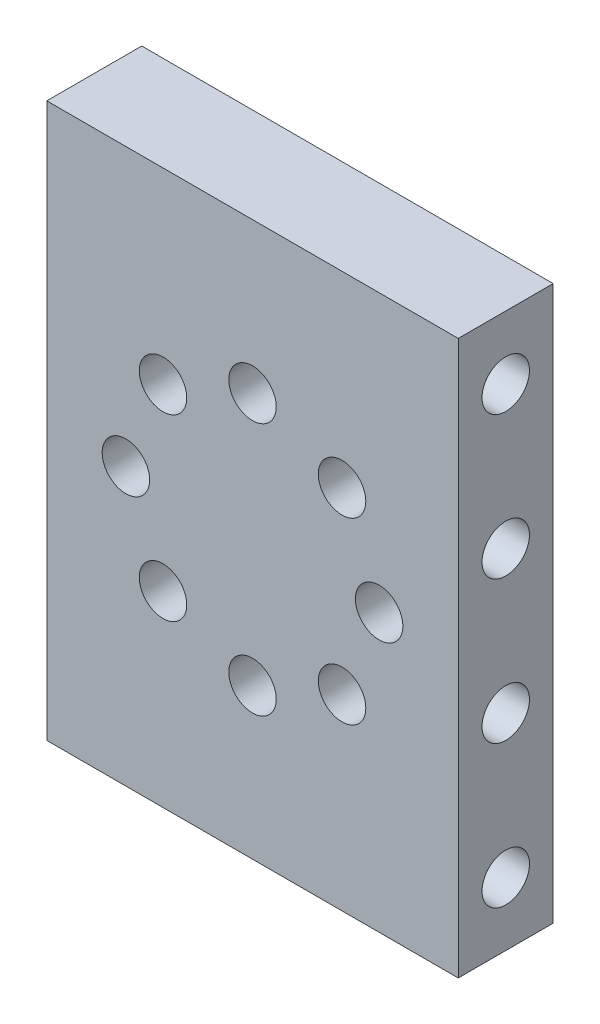
ISO-10303-21;
HEADER;
FILE_DESCRIPTION(('STEP AP214'),'2;1');
FILE_NAME('part.step','',(''),(''),'','','');
FILE_SCHEMA(('AUTOMOTIVE_DESIGN { 1 0 10303 214 1 1 1 1 }'));
ENDSEC;
DATA;
#1=APPLICATION_CONTEXT('core data for automotive mechanical design processes');
#2=APPLICATION_PROTOCOL_DEFINITION('international standard','automotive_design',2000,#1);
#3=PRODUCT_CONTEXT('',#1,'mechanical');
#4=PRODUCT('Part','Part','',(#3));
#5=PRODUCT_RELATED_PRODUCT_CATEGORY('part','',(#4));
#6=PRODUCT_DEFINITION_FORMATION('','',#4);
#7=PRODUCT_DEFINITION_CONTEXT('part definition',#1,'design');
#8=PRODUCT_DEFINITION('design','',#6,#7);
#9=PRODUCT_DEFINITION_SHAPE('','',#8);
#10=(LENGTH_UNIT() NAMED_UNIT(*) SI_UNIT(.MILLI.,.METRE.));
#11=(NAMED_UNIT(*) PLANE_ANGLE_UNIT() SI_UNIT($,.RADIAN.));
#12=(NAMED_UNIT(*) SI_UNIT($,.STERADIAN.) SOLID_ANGLE_UNIT());
#13=UNCERTAINTY_MEASURE_WITH_UNIT(LENGTH_MEASURE(1.E-05),#10,'distance_accuracy_value','');
#14=(GEOMETRIC_REPRESENTATION_CONTEXT(3) GLOBAL_UNCERTAINTY_ASSIGNED_CONTEXT((#13)) GLOBAL_UNIT_ASSIGNED_CONTEXT((#10,
#11,#12)) REPRESENTATION_CONTEXT('',''));
#15=CARTESIAN_POINT('',(0.,0.,0.));
#16=DIRECTION('',(0.,0.,1.));
#17=DIRECTION('',(1.,0.,0.));
#18=AXIS2_PLACEMENT_3D('',#15,#16,#17);
#19=CARTESIAN_POINT('',(-26.,-35.,12.));
#20=DIRECTION('',(1.,0.,0.));
#21=DIRECTION('',(0.,0.,-1.));
#22=AXIS2_PLACEMENT_3D('',#19,#20,#21);
#23=PLANE('',#22);
#24=CARTESIAN_POINT('',(-26.,27.,6.));
#25=DIRECTION('',(-1.,0.,0.));
#26=DIRECTION('',(0.,0.,1.));
#27=AXIS2_PLACEMENT_3D('',#24,#25,#26);
#28=CIRCLE('',#27,3.);
#29=CARTESIAN_POINT('',(-26.,27.,9.));
#30=VERTEX_POINT('',#29);
#31=EDGE_CURVE('E129',#30,#30,#28,.T.);
#32=ORIENTED_EDGE('',*,*,#31,.F.);
#33=EDGE_LOOP('',(#32));
#34=FACE_BOUND('',#33,.T.);
#35=CARTESIAN_POINT('',(-26.,9.00000000000001,6.00000000000019));
#36=DIRECTION('',(-1.,0.,0.));
#37=DIRECTION('',(0.,0.,1.));
#38=AXIS2_PLACEMENT_3D('',#35,#36,#37);
#39=CIRCLE('',#38,3.);
#40=CARTESIAN_POINT('',(-26.,9.00000000000001,9.00000000000019));
#41=VERTEX_POINT('',#40);
#42=EDGE_CURVE('E123',#41,#41,#39,.T.);
#43=ORIENTED_EDGE('',*,*,#42,.F.);
#44=EDGE_LOOP('',(#43));
#45=FACE_BOUND('',#44,.T.);
#46=CARTESIAN_POINT('',(-26.,-8.99999999999999,6.00000000000037));
#47=DIRECTION('',(-1.,0.,0.));
#48=DIRECTION('',(0.,0.,1.));
#49=AXIS2_PLACEMENT_3D('',#46,#47,#48);
#50=CIRCLE('',#49,3.);
#51=CARTESIAN_POINT('',(-26.,-8.99999999999999,9.00000000000038));
#52=VERTEX_POINT('',#51);
#53=EDGE_CURVE('E117',#52,#52,#50,.T.);
#54=ORIENTED_EDGE('',*,*,#53,.F.);
#55=EDGE_LOOP('',(#54));
#56=FACE_BOUND('',#55,.T.);
#57=CARTESIAN_POINT('',(-26.,-27.,6.00000000000056));
#58=DIRECTION('',(-1.,0.,0.));
#59=DIRECTION('',(0.,0.,1.));
#60=AXIS2_PLACEMENT_3D('',#57,#58,#59);
#61=CIRCLE('',#60,3.);
#62=CARTESIAN_POINT('',(-26.,-27.,9.00000000000056));
#63=VERTEX_POINT('',#62);
#64=EDGE_CURVE('E110',#63,#63,#61,.T.);
#65=ORIENTED_EDGE('',*,*,#64,.F.);
#66=EDGE_LOOP('',(#65));
#67=FACE_BOUND('',#66,.T.);
#68=DIRECTION('',(0.,-1.,0.));
#69=VECTOR('',#68,1.);
#70=CARTESIAN_POINT('',(-26.,-35.,0.));
#71=LINE('',#70,#69);
#72=CARTESIAN_POINT('',(-26.,35.,0.));
#73=VERTEX_POINT('',#72);
#74=CARTESIAN_POINT('',(-26.,-35.,0.));
#75=VERTEX_POINT('',#74);
#76=EDGE_CURVE('E96',#73,#75,#71,.T.);
#77=ORIENTED_EDGE('',*,*,#76,.T.);
#78=DIRECTION('',(0.,0.,-1.));
#79=VECTOR('',#78,1.);
#80=CARTESIAN_POINT('',(-26.,-35.,12.));
#81=LINE('',#80,#79);
#82=CARTESIAN_POINT('',(-26.,-35.,12.));
#83=VERTEX_POINT('',#82);
#84=EDGE_CURVE('E11',#83,#75,#81,.T.);
#85=ORIENTED_EDGE('',*,*,#84,.F.);
#86=DIRECTION('',(0.,-1.,0.));
#87=VECTOR('',#86,1.);
#88=CARTESIAN_POINT('',(-26.,-35.,12.));
#89=LINE('',#88,#87);
#90=CARTESIAN_POINT('',(-26.,35.,12.));
#91=VERTEX_POINT('',#90);
#92=EDGE_CURVE('E84',#91,#83,#89,.T.);
#93=ORIENTED_EDGE('',*,*,#92,.F.);
#94=DIRECTION('',(0.,0.,-1.));
#95=VECTOR('',#94,1.);
#96=CARTESIAN_POINT('',(-26.,35.,12.));
#97=LINE('',#96,#95);
#98=EDGE_CURVE('E92',#91,#73,#97,.T.);
#99=ORIENTED_EDGE('',*,*,#98,.T.);
#100=EDGE_LOOP('',(#77,#85,#93,#99));
#101=FACE_BOUND('',#100,.T.);
#102=ADVANCED_FACE('F33',(#34,#45,#56,#67,#101),#23,.F.);
#103=CARTESIAN_POINT('',(26.,-35.,12.));
#104=DIRECTION('',(0.,1.,0.));
#105=DIRECTION('',(-1.,0.,0.));
#106=AXIS2_PLACEMENT_3D('',#103,#104,#105);
#107=PLANE('',#106);
#108=DIRECTION('',(1.,0.,0.));
#109=VECTOR('',#108,1.);
#110=CARTESIAN_POINT('',(26.,-35.,0.));
#111=LINE('',#110,#109);
#112=CARTESIAN_POINT('',(26.,-35.,0.));
#113=VERTEX_POINT('',#112);
#114=EDGE_CURVE('E88',#75,#113,#111,.T.);
#115=ORIENTED_EDGE('',*,*,#114,.T.);
#116=DIRECTION('',(0.,0.,-1.));
#117=VECTOR('',#116,1.);
#118=CARTESIAN_POINT('',(26.,-35.,12.));
#119=LINE('',#118,#117);
#120=CARTESIAN_POINT('',(26.,-35.,12.));
#121=VERTEX_POINT('',#120);
#122=EDGE_CURVE('E41',#121,#113,#119,.T.);
#123=ORIENTED_EDGE('',*,*,#122,.F.);
#124=DIRECTION('',(1.,0.,0.));
#125=VECTOR('',#124,1.);
#126=CARTESIAN_POINT('',(26.,-35.,12.));
#127=LINE('',#126,#125);
#128=EDGE_CURVE('E79',#83,#121,#127,.T.);
#129=ORIENTED_EDGE('',*,*,#128,.F.);
#130=ORIENTED_EDGE('',*,*,#84,.T.);
#131=EDGE_LOOP('',(#115,#123,#129,#130));
#132=FACE_BOUND('',#131,.T.);
#133=ADVANCED_FACE('F87',(#132),#107,.F.);
#134=CARTESIAN_POINT('',(26.,-35.,12.));
#135=DIRECTION('',(-1.,0.,0.));
#136=DIRECTION('',(0.,0.,1.));
#137=AXIS2_PLACEMENT_3D('',#134,#135,#136);
#138=PLANE('',#137);
#139=CARTESIAN_POINT('',(26.,27.,6.));
#140=DIRECTION('',(1.,0.,0.));
#141=DIRECTION('',(0.,0.,-1.));
#142=AXIS2_PLACEMENT_3D('',#139,#140,#141);
#143=CIRCLE('',#142,3.);
#144=CARTESIAN_POINT('',(26.,27.,3.));
#145=VERTEX_POINT('',#144);
#146=EDGE_CURVE('E153',#145,#145,#143,.T.);
#147=ORIENTED_EDGE('',*,*,#146,.F.);
#148=EDGE_LOOP('',(#147));
#149=FACE_BOUND('',#148,.T.);
#150=CARTESIAN_POINT('',(26.,9.00000000000001,5.99999999999981));
#151=DIRECTION('',(1.,0.,0.));
#152=DIRECTION('',(0.,0.,-1.));
#153=AXIS2_PLACEMENT_3D('',#150,#151,#152);
#154=CIRCLE('',#153,3.);
#155=CARTESIAN_POINT('',(26.,9.00000000000001,2.99999999999981));
#156=VERTEX_POINT('',#155);
#157=EDGE_CURVE('E147',#156,#156,#154,.T.);
#158=ORIENTED_EDGE('',*,*,#157,.F.);
#159=EDGE_LOOP('',(#158));
#160=FACE_BOUND('',#159,.T.);
#161=CARTESIAN_POINT('',(26.,-8.99999999999999,5.99999999999963));
#162=DIRECTION('',(1.,0.,0.));
#163=DIRECTION('',(0.,0.,-1.));
#164=AXIS2_PLACEMENT_3D('',#161,#162,#163);
#165=CIRCLE('',#164,3.);
#166=CARTESIAN_POINT('',(26.,-8.99999999999999,2.99999999999963));
#167=VERTEX_POINT('',#166);
#168=EDGE_CURVE('E141',#167,#167,#165,.T.);
#169=ORIENTED_EDGE('',*,*,#168,.F.);
#170=EDGE_LOOP('',(#169));
#171=FACE_BOUND('',#170,.T.);
#172=CARTESIAN_POINT('',(26.,-27.,5.99999999999944));
#173=DIRECTION('',(1.,0.,0.));
#174=DIRECTION('',(0.,0.,-1.));
#175=AXIS2_PLACEMENT_3D('',#172,#173,#174);
#176=CIRCLE('',#175,3.);
#177=CARTESIAN_POINT('',(26.,-27.,2.99999999999944));
#178=VERTEX_POINT('',#177);
#179=EDGE_CURVE('E134',#178,#178,#176,.T.);
#180=ORIENTED_EDGE('',*,*,#179,.F.);
#181=EDGE_LOOP('',(#180));
#182=FACE_BOUND('',#181,.T.);
#183=DIRECTION('',(0.,1.,0.));
#184=VECTOR('',#183,1.);
#185=CARTESIAN_POINT('',(26.,-35.,0.));
#186=LINE('',#185,#184);
#187=CARTESIAN_POINT('',(26.,35.,0.));
#188=VERTEX_POINT('',#187);
#189=EDGE_CURVE('E66',#113,#188,#186,.T.);
#190=ORIENTED_EDGE('',*,*,#189,.T.);
#191=DIRECTION('',(0.,0.,-1.));
#192=VECTOR('',#191,1.);
#193=CARTESIAN_POINT('',(26.,35.,12.));
#194=LINE('',#193,#192);
#195=CARTESIAN_POINT('',(26.,35.,12.));
#196=VERTEX_POINT('',#195);
#197=EDGE_CURVE('E89',#196,#188,#194,.T.);
#198=ORIENTED_EDGE('',*,*,#197,.F.);
#199=DIRECTION('',(0.,1.,0.));
#200=VECTOR('',#199,1.);
#201=CARTESIAN_POINT('',(26.,-35.,12.));
#202=LINE('',#201,#200);
#203=EDGE_CURVE('E82',#121,#196,#202,.T.);
#204=ORIENTED_EDGE('',*,*,#203,.F.);
#205=ORIENTED_EDGE('',*,*,#122,.T.);
#206=EDGE_LOOP('',(#190,#198,#204,#205));
#207=FACE_BOUND('',#206,.T.);
#208=ADVANCED_FACE('F90',(#149,#160,#171,#182,#207),#138,.F.);
#209=CARTESIAN_POINT('',(26.,35.,12.));
#210=DIRECTION('',(0.,-1.,0.));
#211=DIRECTION('',(0.,0.,-1.));
#212=AXIS2_PLACEMENT_3D('',#209,#210,#211);
#213=PLANE('',#212);
#214=DIRECTION('',(-1.,0.,0.));
#215=VECTOR('',#214,1.);
#216=CARTESIAN_POINT('',(26.,35.,0.));
#217=LINE('',#216,#215);
#218=EDGE_CURVE('E72',#188,#73,#217,.T.);
#219=ORIENTED_EDGE('',*,*,#218,.T.);
#220=ORIENTED_EDGE('',*,*,#98,.F.);
#221=DIRECTION('',(-1.,0.,0.));
#222=VECTOR('',#221,1.);
#223=CARTESIAN_POINT('',(26.,35.,12.));
#224=LINE('',#223,#222);
#225=EDGE_CURVE('E49',#196,#91,#224,.T.);
#226=ORIENTED_EDGE('',*,*,#225,.F.);
#227=ORIENTED_EDGE('',*,*,#197,.T.);
#228=EDGE_LOOP('',(#219,#220,#226,#227));
#229=FACE_BOUND('',#228,.T.);
#230=ADVANCED_FACE('F104',(#229),#213,.F.);
#231=CARTESIAN_POINT('',(0.,0.,12.));
#232=DIRECTION('',(0.,0.,1.));
#233=DIRECTION('',(1.,0.,0.));
#234=AXIS2_PLACEMENT_3D('',#231,#232,#233);
#235=PLANE('',#234);
#236=CARTESIAN_POINT('',(11.3137084989849,11.3137084989846,12.));
#237=DIRECTION('',(0.,0.,1.));
#238=DIRECTION('',(1.,0.,0.));
#239=AXIS2_PLACEMENT_3D('',#236,#237,#238);
#240=CIRCLE('',#239,3.);
#241=CARTESIAN_POINT('',(14.3137084989849,11.3137084989846,12.));
#242=VERTEX_POINT('',#241);
#243=EDGE_CURVE('E164',#242,#242,#240,.T.);
#244=ORIENTED_EDGE('',*,*,#243,.F.);
#245=EDGE_LOOP('',(#244));
#246=FACE_BOUND('',#245,.T.);
#247=CARTESIAN_POINT('',(1.6759110426447E-13,16.,12.));
#248=DIRECTION('',(0.,0.,1.));
#249=DIRECTION('',(1.,0.,0.));
#250=AXIS2_PLACEMENT_3D('',#247,#248,#249);
#251=CIRCLE('',#250,3.);
#252=CARTESIAN_POINT('',(3.00000000000017,16.,12.));
#253=VERTEX_POINT('',#252);
#254=EDGE_CURVE('E170',#253,#253,#251,.T.);
#255=ORIENTED_EDGE('',*,*,#254,.F.);
#256=EDGE_LOOP('',(#255));
#257=FACE_BOUND('',#256,.T.);
#258=CARTESIAN_POINT('',(-11.3137084989847,11.3137084989849,12.));
#259=DIRECTION('',(0.,0.,1.));
#260=DIRECTION('',(1.,0.,0.));
#261=AXIS2_PLACEMENT_3D('',#258,#259,#260);
#262=CIRCLE('',#261,3.);
#263=CARTESIAN_POINT('',(-8.31370849898466,11.3137084989849,12.));
#264=VERTEX_POINT('',#263);
#265=EDGE_CURVE('E176',#264,#264,#262,.T.);
#266=ORIENTED_EDGE('',*,*,#265,.F.);
#267=EDGE_LOOP('',(#266));
#268=FACE_BOUND('',#267,.T.);
#269=CARTESIAN_POINT('',(-16.,1.1172740284298E-13,12.));
#270=DIRECTION('',(0.,0.,1.));
#271=DIRECTION('',(1.,0.,0.));
#272=AXIS2_PLACEMENT_3D('',#269,#270,#271);
#273=CIRCLE('',#272,3.);
#274=CARTESIAN_POINT('',(-13.,1.1172740284298E-13,12.));
#275=VERTEX_POINT('',#274);
#276=EDGE_CURVE('E182',#275,#275,#273,.T.);
#277=ORIENTED_EDGE('',*,*,#276,.F.);
#278=EDGE_LOOP('',(#277));
#279=FACE_BOUND('',#278,.T.);
#280=CARTESIAN_POINT('',(-11.3137084989848,-11.3137084989847,12.));
#281=DIRECTION('',(0.,0.,1.));
#282=DIRECTION('',(1.,0.,0.));
#283=AXIS2_PLACEMENT_3D('',#280,#281,#282);
#284=CIRCLE('',#283,3.);
#285=CARTESIAN_POINT('',(-8.31370849898482,-11.3137084989847,12.));
#286=VERTEX_POINT('',#285);
#287=EDGE_CURVE('E188',#286,#286,#284,.T.);
#288=ORIENTED_EDGE('',*,*,#287,.F.);
#289=EDGE_LOOP('',(#288));
#290=FACE_BOUND('',#289,.T.);
#291=CARTESIAN_POINT('',(0.,-16.,12.));
#292=DIRECTION('',(0.,0.,1.));
#293=DIRECTION('',(1.,0.,0.));
#294=AXIS2_PLACEMENT_3D('',#291,#292,#293);
#295=CIRCLE('',#294,3.);
#296=CARTESIAN_POINT('',(2.99999999999995,-16.,12.));
#297=VERTEX_POINT('',#296);
#298=EDGE_CURVE('E194',#297,#297,#295,.T.);
#299=ORIENTED_EDGE('',*,*,#298,.F.);
#300=EDGE_LOOP('',(#299));
#301=FACE_BOUND('',#300,.T.);
#302=CARTESIAN_POINT('',(11.3137084989847,-11.3137084989848,12.));
#303=DIRECTION('',(0.,0.,1.));
#304=DIRECTION('',(1.,0.,0.));
#305=AXIS2_PLACEMENT_3D('',#302,#303,#304);
#306=CIRCLE('',#305,3.);
#307=CARTESIAN_POINT('',(14.3137084989847,-11.3137084989848,12.));
#308=VERTEX_POINT('',#307);
#309=EDGE_CURVE('E200',#308,#308,#306,.T.);
#310=ORIENTED_EDGE('',*,*,#309,.F.);
#311=EDGE_LOOP('',(#310));
#312=FACE_BOUND('',#311,.T.);
#313=CARTESIAN_POINT('',(16.,0.,12.));
#314=DIRECTION('',(0.,0.,1.));
#315=DIRECTION('',(1.,0.,0.));
#316=AXIS2_PLACEMENT_3D('',#313,#314,#315);
#317=CIRCLE('',#316,3.);
#318=CARTESIAN_POINT('',(19.,0.,12.));
#319=VERTEX_POINT('',#318);
#320=EDGE_CURVE('E158',#319,#319,#317,.T.);
#321=ORIENTED_EDGE('',*,*,#320,.F.);
#322=EDGE_LOOP('',(#321));
#323=FACE_BOUND('',#322,.T.);
#324=ORIENTED_EDGE('',*,*,#92,.T.);
#325=ORIENTED_EDGE('',*,*,#128,.T.);
#326=ORIENTED_EDGE('',*,*,#203,.T.);
#327=ORIENTED_EDGE('',*,*,#225,.T.);
#328=EDGE_LOOP('',(#324,#325,#326,#327));
#329=FACE_BOUND('',#328,.T.);
#330=ADVANCED_FACE('F80',(#246,#257,#268,#279,#290,#301,#312,#323,#329),#235,.T.);
#331=CARTESIAN_POINT('',(0.,0.,0.));
#332=DIRECTION('',(0.,0.,1.));
#333=DIRECTION('',(1.,0.,0.));
#334=AXIS2_PLACEMENT_3D('',#331,#332,#333);
#335=PLANE('',#334);
#336=CARTESIAN_POINT('',(11.3137084989849,11.3137084989846,0.));
#337=DIRECTION('',(0.,0.,1.));
#338=DIRECTION('',(1.,0.,0.));
#339=AXIS2_PLACEMENT_3D('',#336,#337,#338);
#340=CIRCLE('',#339,3.);
#341=CARTESIAN_POINT('',(14.3137084989849,11.3137084989846,0.));
#342=VERTEX_POINT('',#341);
#343=EDGE_CURVE('E167',#342,#342,#340,.T.);
#344=ORIENTED_EDGE('',*,*,#343,.T.);
#345=EDGE_LOOP('',(#344));
#346=FACE_BOUND('',#345,.T.);
#347=CARTESIAN_POINT('',(1.6759110426447E-13,16.,0.));
#348=DIRECTION('',(0.,0.,1.));
#349=DIRECTION('',(1.,0.,0.));
#350=AXIS2_PLACEMENT_3D('',#347,#348,#349);
#351=CIRCLE('',#350,3.);
#352=CARTESIAN_POINT('',(3.00000000000017,16.,0.));
#353=VERTEX_POINT('',#352);
#354=EDGE_CURVE('E173',#353,#353,#351,.T.);
#355=ORIENTED_EDGE('',*,*,#354,.T.);
#356=EDGE_LOOP('',(#355));
#357=FACE_BOUND('',#356,.T.);
#358=CARTESIAN_POINT('',(-11.3137084989847,11.3137084989849,0.));
#359=DIRECTION('',(0.,0.,1.));
#360=DIRECTION('',(1.,0.,0.));
#361=AXIS2_PLACEMENT_3D('',#358,#359,#360);
#362=CIRCLE('',#361,3.);
#363=CARTESIAN_POINT('',(-8.31370849898466,11.3137084989849,0.));
#364=VERTEX_POINT('',#363);
#365=EDGE_CURVE('E179',#364,#364,#362,.T.);
#366=ORIENTED_EDGE('',*,*,#365,.T.);
#367=EDGE_LOOP('',(#366));
#368=FACE_BOUND('',#367,.T.);
#369=CARTESIAN_POINT('',(-16.,1.1172740284298E-13,0.));
#370=DIRECTION('',(0.,0.,1.));
#371=DIRECTION('',(1.,0.,0.));
#372=AXIS2_PLACEMENT_3D('',#369,#370,#371);
#373=CIRCLE('',#372,3.);
#374=CARTESIAN_POINT('',(-13.,1.1172740284298E-13,0.));
#375=VERTEX_POINT('',#374);
#376=EDGE_CURVE('E185',#375,#375,#373,.T.);
#377=ORIENTED_EDGE('',*,*,#376,.T.);
#378=EDGE_LOOP('',(#377));
#379=FACE_BOUND('',#378,.T.);
#380=CARTESIAN_POINT('',(-11.3137084989848,-11.3137084989847,0.));
#381=DIRECTION('',(0.,0.,1.));
#382=DIRECTION('',(1.,0.,0.));
#383=AXIS2_PLACEMENT_3D('',#380,#381,#382);
#384=CIRCLE('',#383,3.);
#385=CARTESIAN_POINT('',(-8.31370849898482,-11.3137084989847,0.));
#386=VERTEX_POINT('',#385);
#387=EDGE_CURVE('E191',#386,#386,#384,.T.);
#388=ORIENTED_EDGE('',*,*,#387,.T.);
#389=EDGE_LOOP('',(#388));
#390=FACE_BOUND('',#389,.T.);
#391=CARTESIAN_POINT('',(0.,-16.,0.));
#392=DIRECTION('',(0.,0.,1.));
#393=DIRECTION('',(1.,0.,0.));
#394=AXIS2_PLACEMENT_3D('',#391,#392,#393);
#395=CIRCLE('',#394,3.);
#396=CARTESIAN_POINT('',(2.99999999999995,-16.,0.));
#397=VERTEX_POINT('',#396);
#398=EDGE_CURVE('E197',#397,#397,#395,.T.);
#399=ORIENTED_EDGE('',*,*,#398,.T.);
#400=EDGE_LOOP('',(#399));
#401=FACE_BOUND('',#400,.T.);
#402=CARTESIAN_POINT('',(11.3137084989847,-11.3137084989848,0.));
#403=DIRECTION('',(0.,0.,1.));
#404=DIRECTION('',(1.,0.,0.));
#405=AXIS2_PLACEMENT_3D('',#402,#403,#404);
#406=CIRCLE('',#405,3.);
#407=CARTESIAN_POINT('',(14.3137084989847,-11.3137084989848,0.));
#408=VERTEX_POINT('',#407);
#409=EDGE_CURVE('E161',#408,#408,#406,.T.);
#410=ORIENTED_EDGE('',*,*,#409,.T.);
#411=EDGE_LOOP('',(#410));
#412=FACE_BOUND('',#411,.T.);
#413=CARTESIAN_POINT('',(16.,0.,0.));
#414=DIRECTION('',(0.,0.,1.));
#415=DIRECTION('',(1.,0.,0.));
#416=AXIS2_PLACEMENT_3D('',#413,#414,#415);
#417=CIRCLE('',#416,3.);
#418=CARTESIAN_POINT('',(19.,0.,0.));
#419=VERTEX_POINT('',#418);
#420=EDGE_CURVE('E138',#419,#419,#417,.T.);
#421=ORIENTED_EDGE('',*,*,#420,.T.);
#422=EDGE_LOOP('',(#421));
#423=FACE_BOUND('',#422,.T.);
#424=ORIENTED_EDGE('',*,*,#76,.F.);
#425=ORIENTED_EDGE('',*,*,#218,.F.);
#426=ORIENTED_EDGE('',*,*,#189,.F.);
#427=ORIENTED_EDGE('',*,*,#114,.F.);
#428=EDGE_LOOP('',(#424,#425,#426,#427));
#429=FACE_BOUND('',#428,.T.);
#430=ADVANCED_FACE('F107',(#346,#357,#368,#379,#390,#401,#412,#423,#429),#335,.F.);
#431=CARTESIAN_POINT('',(-16.,-27.,6.00000000000056));
#432=DIRECTION('',(-1.,0.,0.));
#433=DIRECTION('',(0.,0.,1.));
#434=AXIS2_PLACEMENT_3D('',#431,#432,#433);
#435=CYLINDRICAL_SURFACE('',#434,3.);
#436=CARTESIAN_POINT('',(-16.,-27.,6.00000000000056));
#437=DIRECTION('',(-1.,0.,0.));
#438=DIRECTION('',(0.,0.,1.));
#439=AXIS2_PLACEMENT_3D('',#436,#437,#438);
#440=CIRCLE('',#439,3.);
#441=CARTESIAN_POINT('',(-16.,-27.,9.00000000000056));
#442=VERTEX_POINT('',#441);
#443=EDGE_CURVE('E113',#442,#442,#440,.T.);
#444=ORIENTED_EDGE('',*,*,#443,.F.);
#445=EDGE_LOOP('',(#444));
#446=FACE_BOUND('',#445,.T.);
#447=ORIENTED_EDGE('',*,*,#64,.T.);
#448=EDGE_LOOP('',(#447));
#449=FACE_BOUND('',#448,.T.);
#450=ADVANCED_FACE('F247',(#446,#449),#435,.F.);
#451=CARTESIAN_POINT('',(-16.,-27.,6.00000000000056));
#452=DIRECTION('',(-1.,0.,0.));
#453=DIRECTION('',(0.,0.,1.));
#454=AXIS2_PLACEMENT_3D('',#451,#452,#453);
#455=PLANE('',#454);
#456=ORIENTED_EDGE('',*,*,#443,.T.);
#457=EDGE_LOOP('',(#456));
#458=FACE_BOUND('',#457,.T.);
#459=ADVANCED_FACE('F249',(#458),#455,.T.);
#460=CARTESIAN_POINT('',(-16.,-8.99999999999999,6.00000000000037));
#461=DIRECTION('',(-1.,0.,0.));
#462=DIRECTION('',(0.,0.,1.));
#463=AXIS2_PLACEMENT_3D('',#460,#461,#462);
#464=CYLINDRICAL_SURFACE('',#463,3.);
#465=CARTESIAN_POINT('',(-16.,-8.99999999999999,6.00000000000037));
#466=DIRECTION('',(-1.,0.,0.));
#467=DIRECTION('',(0.,0.,1.));
#468=AXIS2_PLACEMENT_3D('',#465,#466,#467);
#469=CIRCLE('',#468,3.);
#470=CARTESIAN_POINT('',(-16.,-8.99999999999999,9.00000000000038));
#471=VERTEX_POINT('',#470);
#472=EDGE_CURVE('E120',#471,#471,#469,.T.);
#473=ORIENTED_EDGE('',*,*,#472,.F.);
#474=EDGE_LOOP('',(#473));
#475=FACE_BOUND('',#474,.T.);
#476=ORIENTED_EDGE('',*,*,#53,.T.);
#477=EDGE_LOOP('',(#476));
#478=FACE_BOUND('',#477,.T.);
#479=ADVANCED_FACE('F256',(#475,#478),#464,.F.);
#480=CARTESIAN_POINT('',(-16.,-8.99999999999999,6.00000000000037));
#481=DIRECTION('',(-1.,0.,0.));
#482=DIRECTION('',(0.,0.,1.));
#483=AXIS2_PLACEMENT_3D('',#480,#481,#482);
#484=PLANE('',#483);
#485=ORIENTED_EDGE('',*,*,#472,.T.);
#486=EDGE_LOOP('',(#485));
#487=FACE_BOUND('',#486,.T.);
#488=ADVANCED_FACE('F307',(#487),#484,.T.);
#489=CARTESIAN_POINT('',(-16.,9.00000000000001,6.00000000000019));
#490=DIRECTION('',(-1.,0.,0.));
#491=DIRECTION('',(0.,0.,1.));
#492=AXIS2_PLACEMENT_3D('',#489,#490,#491);
#493=CYLINDRICAL_SURFACE('',#492,3.);
#494=CARTESIAN_POINT('',(-16.,9.00000000000001,6.00000000000019));
#495=DIRECTION('',(-1.,0.,0.));
#496=DIRECTION('',(0.,0.,1.));
#497=AXIS2_PLACEMENT_3D('',#494,#495,#496);
#498=CIRCLE('',#497,3.);
#499=CARTESIAN_POINT('',(-16.,9.00000000000001,9.00000000000019));
#500=VERTEX_POINT('',#499);
#501=EDGE_CURVE('E126',#500,#500,#498,.T.);
#502=ORIENTED_EDGE('',*,*,#501,.F.);
#503=EDGE_LOOP('',(#502));
#504=FACE_BOUND('',#503,.T.);
#505=ORIENTED_EDGE('',*,*,#42,.T.);
#506=EDGE_LOOP('',(#505));
#507=FACE_BOUND('',#506,.T.);
#508=ADVANCED_FACE('F303',(#504,#507),#493,.F.);
#509=CARTESIAN_POINT('',(-16.,9.00000000000001,6.00000000000019));
#510=DIRECTION('',(-1.,0.,0.));
#511=DIRECTION('',(0.,0.,1.));
#512=AXIS2_PLACEMENT_3D('',#509,#510,#511);
#513=PLANE('',#512);
#514=ORIENTED_EDGE('',*,*,#501,.T.);
#515=EDGE_LOOP('',(#514));
#516=FACE_BOUND('',#515,.T.);
#517=ADVANCED_FACE('F299',(#516),#513,.T.);
#518=CARTESIAN_POINT('',(-16.,27.,6.));
#519=DIRECTION('',(-1.,0.,0.));
#520=DIRECTION('',(0.,0.,1.));
#521=AXIS2_PLACEMENT_3D('',#518,#519,#520);
#522=CYLINDRICAL_SURFACE('',#521,3.);
#523=CARTESIAN_POINT('',(-16.,27.,6.));
#524=DIRECTION('',(-1.,0.,0.));
#525=DIRECTION('',(0.,0.,1.));
#526=AXIS2_PLACEMENT_3D('',#523,#524,#525);
#527=CIRCLE('',#526,3.);
#528=CARTESIAN_POINT('',(-16.,27.,9.));
#529=VERTEX_POINT('',#528);
#530=EDGE_CURVE('E99',#529,#529,#527,.T.);
#531=ORIENTED_EDGE('',*,*,#530,.F.);
#532=EDGE_LOOP('',(#531));
#533=FACE_BOUND('',#532,.T.);
#534=ORIENTED_EDGE('',*,*,#31,.T.);
#535=EDGE_LOOP('',(#534));
#536=FACE_BOUND('',#535,.T.);
#537=ADVANCED_FACE('F291',(#533,#536),#522,.F.);
#538=CARTESIAN_POINT('',(-16.,27.,6.));
#539=DIRECTION('',(-1.,0.,0.));
#540=DIRECTION('',(0.,0.,1.));
#541=AXIS2_PLACEMENT_3D('',#538,#539,#540);
#542=PLANE('',#541);
#543=ORIENTED_EDGE('',*,*,#530,.T.);
#544=EDGE_LOOP('',(#543));
#545=FACE_BOUND('',#544,.T.);
#546=ADVANCED_FACE('F281',(#545),#542,.T.);
#547=CARTESIAN_POINT('',(16.,-27.,5.99999999999944));
#548=DIRECTION('',(1.,0.,0.));
#549=DIRECTION('',(0.,0.,-1.));
#550=AXIS2_PLACEMENT_3D('',#547,#548,#549);
#551=CYLINDRICAL_SURFACE('',#550,3.);
#552=CARTESIAN_POINT('',(16.,-27.,5.99999999999944));
#553=DIRECTION('',(1.,0.,0.));
#554=DIRECTION('',(0.,0.,-1.));
#555=AXIS2_PLACEMENT_3D('',#552,#553,#554);
#556=CIRCLE('',#555,3.);
#557=CARTESIAN_POINT('',(16.,-27.,2.99999999999944));
#558=VERTEX_POINT('',#557);
#559=EDGE_CURVE('E137',#558,#558,#556,.T.);
#560=ORIENTED_EDGE('',*,*,#559,.F.);
#561=EDGE_LOOP('',(#560));
#562=FACE_BOUND('',#561,.T.);
#563=ORIENTED_EDGE('',*,*,#179,.T.);
#564=EDGE_LOOP('',(#563));
#565=FACE_BOUND('',#564,.T.);
#566=ADVANCED_FACE('F278',(#562,#565),#551,.F.);
#567=CARTESIAN_POINT('',(16.,-27.,5.99999999999944));
#568=DIRECTION('',(1.,0.,0.));
#569=DIRECTION('',(0.,0.,-1.));
#570=AXIS2_PLACEMENT_3D('',#567,#568,#569);
#571=PLANE('',#570);
#572=ORIENTED_EDGE('',*,*,#559,.T.);
#573=EDGE_LOOP('',(#572));
#574=FACE_BOUND('',#573,.T.);
#575=ADVANCED_FACE('F280',(#574),#571,.T.);
#576=CARTESIAN_POINT('',(16.,-8.99999999999999,5.99999999999963));
#577=DIRECTION('',(1.,0.,0.));
#578=DIRECTION('',(0.,0.,-1.));
#579=AXIS2_PLACEMENT_3D('',#576,#577,#578);
#580=CYLINDRICAL_SURFACE('',#579,3.);
#581=CARTESIAN_POINT('',(16.,-8.99999999999999,5.99999999999963));
#582=DIRECTION('',(1.,0.,0.));
#583=DIRECTION('',(0.,0.,-1.));
#584=AXIS2_PLACEMENT_3D('',#581,#582,#583);
#585=CIRCLE('',#584,3.);
#586=CARTESIAN_POINT('',(16.,-8.99999999999999,2.99999999999963));
#587=VERTEX_POINT('',#586);
#588=EDGE_CURVE('E144',#587,#587,#585,.T.);
#589=ORIENTED_EDGE('',*,*,#588,.F.);
#590=EDGE_LOOP('',(#589));
#591=FACE_BOUND('',#590,.T.);
#592=ORIENTED_EDGE('',*,*,#168,.T.);
#593=EDGE_LOOP('',(#592));
#594=FACE_BOUND('',#593,.T.);
#595=ADVANCED_FACE('F288',(#591,#594),#580,.F.);
#596=CARTESIAN_POINT('',(16.,-8.99999999999999,5.99999999999963));
#597=DIRECTION('',(1.,0.,0.));
#598=DIRECTION('',(0.,0.,-1.));
#599=AXIS2_PLACEMENT_3D('',#596,#597,#598);
#600=PLANE('',#599);
#601=ORIENTED_EDGE('',*,*,#588,.T.);
#602=EDGE_LOOP('',(#601));
#603=FACE_BOUND('',#602,.T.);
#604=ADVANCED_FACE('F364',(#603),#600,.T.);
#605=CARTESIAN_POINT('',(16.,9.00000000000001,5.99999999999981));
#606=DIRECTION('',(1.,0.,0.));
#607=DIRECTION('',(0.,0.,-1.));
#608=AXIS2_PLACEMENT_3D('',#605,#606,#607);
#609=CYLINDRICAL_SURFACE('',#608,3.);
#610=CARTESIAN_POINT('',(16.,9.00000000000001,5.99999999999981));
#611=DIRECTION('',(1.,0.,0.));
#612=DIRECTION('',(0.,0.,-1.));
#613=AXIS2_PLACEMENT_3D('',#610,#611,#612);
#614=CIRCLE('',#613,3.);
#615=CARTESIAN_POINT('',(16.,9.00000000000001,2.99999999999981));
#616=VERTEX_POINT('',#615);
#617=EDGE_CURVE('E150',#616,#616,#614,.T.);
#618=ORIENTED_EDGE('',*,*,#617,.F.);
#619=EDGE_LOOP('',(#618));
#620=FACE_BOUND('',#619,.T.);
#621=ORIENTED_EDGE('',*,*,#157,.T.);
#622=EDGE_LOOP('',(#621));
#623=FACE_BOUND('',#622,.T.);
#624=ADVANCED_FACE('F373',(#620,#623),#609,.F.);
#625=CARTESIAN_POINT('',(16.,9.00000000000001,5.99999999999981));
#626=DIRECTION('',(1.,0.,0.));
#627=DIRECTION('',(0.,0.,-1.));
#628=AXIS2_PLACEMENT_3D('',#625,#626,#627);
#629=PLANE('',#628);
#630=ORIENTED_EDGE('',*,*,#617,.T.);
#631=EDGE_LOOP('',(#630));
#632=FACE_BOUND('',#631,.T.);
#633=ADVANCED_FACE('F383',(#632),#629,.T.);
#634=CARTESIAN_POINT('',(16.,27.,6.));
#635=DIRECTION('',(1.,0.,0.));
#636=DIRECTION('',(0.,0.,-1.));
#637=AXIS2_PLACEMENT_3D('',#634,#635,#636);
#638=CYLINDRICAL_SURFACE('',#637,3.);
#639=CARTESIAN_POINT('',(16.,27.,6.));
#640=DIRECTION('',(1.,0.,0.));
#641=DIRECTION('',(0.,0.,-1.));
#642=AXIS2_PLACEMENT_3D('',#639,#640,#641);
#643=CIRCLE('',#642,3.);
#644=CARTESIAN_POINT('',(16.,27.,3.));
#645=VERTEX_POINT('',#644);
#646=EDGE_CURVE('E114',#645,#645,#643,.T.);
#647=ORIENTED_EDGE('',*,*,#646,.F.);
#648=EDGE_LOOP('',(#647));
#649=FACE_BOUND('',#648,.T.);
#650=ORIENTED_EDGE('',*,*,#146,.T.);
#651=EDGE_LOOP('',(#650));
#652=FACE_BOUND('',#651,.T.);
#653=ADVANCED_FACE('F229',(#649,#652),#638,.F.);
#654=CARTESIAN_POINT('',(16.,27.,6.));
#655=DIRECTION('',(1.,0.,0.));
#656=DIRECTION('',(0.,0.,-1.));
#657=AXIS2_PLACEMENT_3D('',#654,#655,#656);
#658=PLANE('',#657);
#659=ORIENTED_EDGE('',*,*,#646,.T.);
#660=EDGE_LOOP('',(#659));
#661=FACE_BOUND('',#660,.T.);
#662=ADVANCED_FACE('F223',(#661),#658,.T.);
#663=CARTESIAN_POINT('',(16.,0.,0.));
#664=DIRECTION('',(0.,0.,1.));
#665=DIRECTION('',(1.,0.,0.));
#666=AXIS2_PLACEMENT_3D('',#663,#664,#665);
#667=CYLINDRICAL_SURFACE('',#666,3.);
#668=ORIENTED_EDGE('',*,*,#420,.F.);
#669=EDGE_LOOP('',(#668));
#670=FACE_BOUND('',#669,.T.);
#671=ORIENTED_EDGE('',*,*,#320,.T.);
#672=EDGE_LOOP('',(#671));
#673=FACE_BOUND('',#672,.T.);
#674=ADVANCED_FACE('F212',(#670,#673),#667,.F.);
#675=CARTESIAN_POINT('',(11.3137084989847,-11.3137084989848,0.));
#676=DIRECTION('',(0.,0.,1.));
#677=DIRECTION('',(1.,0.,0.));
#678=AXIS2_PLACEMENT_3D('',#675,#676,#677);
#679=CYLINDRICAL_SURFACE('',#678,3.);
#680=ORIENTED_EDGE('',*,*,#409,.F.);
#681=EDGE_LOOP('',(#680));
#682=FACE_BOUND('',#681,.T.);
#683=ORIENTED_EDGE('',*,*,#309,.T.);
#684=EDGE_LOOP('',(#683));
#685=FACE_BOUND('',#684,.T.);
#686=ADVANCED_FACE('F208',(#682,#685),#679,.F.);
#687=CARTESIAN_POINT('',(0.,-16.,0.));
#688=DIRECTION('',(0.,0.,1.));
#689=DIRECTION('',(1.,0.,0.));
#690=AXIS2_PLACEMENT_3D('',#687,#688,#689);
#691=CYLINDRICAL_SURFACE('',#690,3.);
#692=ORIENTED_EDGE('',*,*,#398,.F.);
#693=EDGE_LOOP('',(#692));
#694=FACE_BOUND('',#693,.T.);
#695=ORIENTED_EDGE('',*,*,#298,.T.);
#696=EDGE_LOOP('',(#695));
#697=FACE_BOUND('',#696,.T.);
#698=ADVANCED_FACE('F211',(#694,#697),#691,.F.);
#699=CARTESIAN_POINT('',(-11.3137084989848,-11.3137084989847,0.));
#700=DIRECTION('',(0.,0.,1.));
#701=DIRECTION('',(1.,0.,0.));
#702=AXIS2_PLACEMENT_3D('',#699,#700,#701);
#703=CYLINDRICAL_SURFACE('',#702,3.);
#704=ORIENTED_EDGE('',*,*,#387,.F.);
#705=EDGE_LOOP('',(#704));
#706=FACE_BOUND('',#705,.T.);
#707=ORIENTED_EDGE('',*,*,#287,.T.);
#708=EDGE_LOOP('',(#707));
#709=FACE_BOUND('',#708,.T.);
#710=ADVANCED_FACE('F440',(#706,#709),#703,.F.);
#711=CARTESIAN_POINT('',(-16.,1.1172740284298E-13,0.));
#712=DIRECTION('',(0.,0.,1.));
#713=DIRECTION('',(1.,0.,0.));
#714=AXIS2_PLACEMENT_3D('',#711,#712,#713);
#715=CYLINDRICAL_SURFACE('',#714,3.);
#716=ORIENTED_EDGE('',*,*,#376,.F.);
#717=EDGE_LOOP('',(#716));
#718=FACE_BOUND('',#717,.T.);
#719=ORIENTED_EDGE('',*,*,#276,.T.);
#720=EDGE_LOOP('',(#719));
#721=FACE_BOUND('',#720,.T.);
#722=ADVANCED_FACE('F450',(#718,#721),#715,.F.);
#723=CARTESIAN_POINT('',(-11.3137084989847,11.3137084989849,0.));
#724=DIRECTION('',(0.,0.,1.));
#725=DIRECTION('',(1.,0.,0.));
#726=AXIS2_PLACEMENT_3D('',#723,#724,#725);
#727=CYLINDRICAL_SURFACE('',#726,3.);
#728=ORIENTED_EDGE('',*,*,#365,.F.);
#729=EDGE_LOOP('',(#728));
#730=FACE_BOUND('',#729,.T.);
#731=ORIENTED_EDGE('',*,*,#265,.T.);
#732=EDGE_LOOP('',(#731));
#733=FACE_BOUND('',#732,.T.);
#734=ADVANCED_FACE('F460',(#730,#733),#727,.F.);
#735=CARTESIAN_POINT('',(1.6759110426447E-13,16.,0.));
#736=DIRECTION('',(0.,0.,1.));
#737=DIRECTION('',(1.,0.,0.));
#738=AXIS2_PLACEMENT_3D('',#735,#736,#737);
#739=CYLINDRICAL_SURFACE('',#738,3.);
#740=ORIENTED_EDGE('',*,*,#354,.F.);
#741=EDGE_LOOP('',(#740));
#742=FACE_BOUND('',#741,.T.);
#743=ORIENTED_EDGE('',*,*,#254,.T.);
#744=EDGE_LOOP('',(#743));
#745=FACE_BOUND('',#744,.T.);
#746=ADVANCED_FACE('F470',(#742,#745),#739,.F.);
#747=CARTESIAN_POINT('',(11.3137084989849,11.3137084989846,0.));
#748=DIRECTION('',(0.,0.,1.));
#749=DIRECTION('',(1.,0.,0.));
#750=AXIS2_PLACEMENT_3D('',#747,#748,#749);
#751=CYLINDRICAL_SURFACE('',#750,3.);
#752=ORIENTED_EDGE('',*,*,#343,.F.);
#753=EDGE_LOOP('',(#752));
#754=FACE_BOUND('',#753,.T.);
#755=ORIENTED_EDGE('',*,*,#243,.T.);
#756=EDGE_LOOP('',(#755));
#757=FACE_BOUND('',#756,.T.);
#758=ADVANCED_FACE('F480',(#754,#757),#751,.F.);
#759=CLOSED_SHELL('',(#102,#133,#208,#230,#330,#430,#450,#459,#479,#488,#508,#517,#537,#546,
#566,#575,#595,#604,#624,#633,#653,#662,#674,#686,#698,#710,#722,#734,#746,#758));
#760=MANIFOLD_SOLID_BREP('B2',#759);
#761=ADVANCED_BREP_SHAPE_REPRESENTATION('',(#18,#760),#14);
#762=SHAPE_DEFINITION_REPRESENTATION(#9,#761);
ENDSEC;
END-ISO-10303-21;
